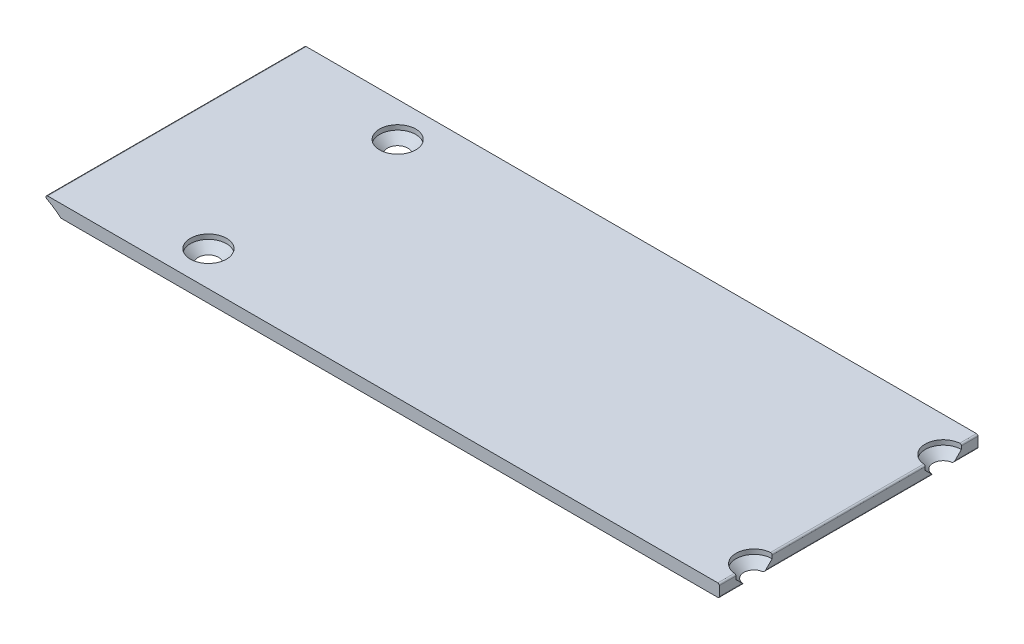
ISO-10303-21;
HEADER;
FILE_DESCRIPTION(('STEP AP214'),'2;1');
FILE_NAME('part.step','',(''),(''),'','','');
FILE_SCHEMA(('AUTOMOTIVE_DESIGN { 1 0 10303 214 1 1 1 1 }'));
ENDSEC;
DATA;
#1=APPLICATION_CONTEXT('core data for automotive mechanical design processes');
#2=APPLICATION_PROTOCOL_DEFINITION('international standard','automotive_design',2000,#1);
#3=PRODUCT_CONTEXT('',#1,'mechanical');
#4=PRODUCT('Part','Part','',(#3));
#5=PRODUCT_RELATED_PRODUCT_CATEGORY('part','',(#4));
#6=PRODUCT_DEFINITION_FORMATION('','',#4);
#7=PRODUCT_DEFINITION_CONTEXT('part definition',#1,'design');
#8=PRODUCT_DEFINITION('design','',#6,#7);
#9=PRODUCT_DEFINITION_SHAPE('','',#8);
#10=(LENGTH_UNIT() NAMED_UNIT(*) SI_UNIT(.MILLI.,.METRE.));
#11=(NAMED_UNIT(*) PLANE_ANGLE_UNIT() SI_UNIT($,.RADIAN.));
#12=(NAMED_UNIT(*) SI_UNIT($,.STERADIAN.) SOLID_ANGLE_UNIT());
#13=UNCERTAINTY_MEASURE_WITH_UNIT(LENGTH_MEASURE(1.E-05),#10,'distance_accuracy_value','');
#14=(GEOMETRIC_REPRESENTATION_CONTEXT(3) GLOBAL_UNCERTAINTY_ASSIGNED_CONTEXT((#13)) GLOBAL_UNIT_ASSIGNED_CONTEXT((#10,
#11,#12)) REPRESENTATION_CONTEXT('',''));
#15=CARTESIAN_POINT('',(0.,0.,0.));
#16=DIRECTION('',(0.,0.,1.));
#17=DIRECTION('',(1.,0.,0.));
#18=AXIS2_PLACEMENT_3D('',#15,#16,#17);
#19=CARTESIAN_POINT('',(224.5,19.5,-49.5));
#20=DIRECTION('',(0.,0.,1.));
#21=DIRECTION('',(1.,0.,0.));
#22=AXIS2_PLACEMENT_3D('',#19,#20,#21);
#23=CYLINDRICAL_SURFACE('',#22,0.5);
#24=CARTESIAN_POINT('',(224.997473577188,19.5502,-15.7148008431276));
#25=CARTESIAN_POINT('',(224.999435346923,19.5306837247014,-15.7343171943502));
#26=CARTESIAN_POINT('',(225.000256593285,19.5111223870043,-15.7538777715121));
#27=CARTESIAN_POINT('',(224.999601023149,19.4720030494915,-15.7929967929649));
#28=CARTESIAN_POINT('',(224.998122243349,19.4524450667953,-15.8125552211662));
#29=CARTESIAN_POINT('',(224.99017401051,19.3937144747557,-15.8712933209623));
#30=CARTESIAN_POINT('',(224.980166584883,19.3547410268954,-15.9102800763842));
#31=CARTESIAN_POINT('',(224.953567431979,19.2871812312321,-15.9781053720694));
#32=CARTESIAN_POINT('',(224.938891636266,19.2581856697315,-16.0073003058562));
#33=CARTESIAN_POINT('',(224.903194213026,19.2024707982459,-16.0638424882896));
#34=CARTESIAN_POINT('',(224.88219241513,19.1757447051486,-16.0911951884736));
#35=CARTESIAN_POINT('',(224.839462094014,19.1319502493728,-16.1368248142612));
#36=CARTESIAN_POINT('',(224.819151566163,19.1141135932451,-16.1556915148958));
#37=CARTESIAN_POINT('',(224.774671280116,19.0812905891297,-16.1912916478937));
#38=CARTESIAN_POINT('',(224.750504172319,19.0663022990168,-16.2080265312267));
#39=CARTESIAN_POINT('',(224.70379875283,19.0428308841408,-16.2355080086869));
#40=CARTESIAN_POINT('',(224.681925143516,19.0336448917808,-16.246780652257));
#41=CARTESIAN_POINT('',(224.636183047505,19.0183006870291,-16.2670187878611));
#42=CARTESIAN_POINT('',(224.612319992086,19.012134527886,-16.2759903053624));
#43=CARTESIAN_POINT('',(224.565616294764,19.0038197606833,-16.2903620019993));
#44=CARTESIAN_POINT('',(224.542923613795,19.0013226866013,-16.296034897223));
#45=CARTESIAN_POINT('',(224.496756074885,18.9994647849751,-16.3048342443327));
#46=CARTESIAN_POINT('',(224.47327660572,19.0001277735789,-16.3079411512267));
#47=CARTESIAN_POINT('',(224.4498,19.0025264228122,-16.3095678508379));
#48=B_SPLINE_CURVE_WITH_KNOTS('',3,(#24,#25,#26,#27,#28,#29,#30,#31,#32,#33,#34,#35,#36,#37,#38,
#39,#40,#41,#42,#43,#44,#45,#46,#47),.UNSPECIFIED.,.F.,.F.,(4,2,2,2,2,2,2,2,2,2,2,4),(0.,
0.0829495843265933,0.165970013303474,0.333085915997445,0.463694854194707,0.593898569508019,
0.692447709658672,0.790929412223871,0.869426002124152,0.947714901650063,1.01793790593091,
1.08869098652575),.UNSPECIFIED.);
#49=CARTESIAN_POINT('',(225.000000000001,19.5,-15.765));
#50=VERTEX_POINT('',#49);
#51=CARTESIAN_POINT('',(224.5,19.,-16.3038734380504));
#52=VERTEX_POINT('',#51);
#53=EDGE_CURVE('E11',#50,#52,#48,.T.);
#54=ORIENTED_EDGE('',*,*,#53,.F.);
#55=DIRECTION('',(0.,0.,1.));
#56=VECTOR('',#55,1.);
#57=CARTESIAN_POINT('',(225.,19.5,-49.5));
#58=LINE('',#57,#56);
#59=CARTESIAN_POINT('',(225.,19.5,-8.5));
#60=VERTEX_POINT('',#59);
#61=EDGE_CURVE('E322',#60,#50,#58,.F.);
#62=ORIENTED_EDGE('',*,*,#61,.F.);
#63=CARTESIAN_POINT('',(224.5,19.5,-8.5));
#64=DIRECTION('',(0.,0.,1.));
#65=DIRECTION('',(1.,0.,0.));
#66=AXIS2_PLACEMENT_3D('',#63,#64,#65);
#67=CIRCLE('',#66,0.5);
#68=CARTESIAN_POINT('',(224.5,19.,-8.5));
#69=VERTEX_POINT('',#68);
#70=EDGE_CURVE('E316',#69,#60,#67,.T.);
#71=ORIENTED_EDGE('',*,*,#70,.F.);
#72=DIRECTION('',(0.,0.,1.));
#73=VECTOR('',#72,1.);
#74=CARTESIAN_POINT('',(224.5,19.,-49.5));
#75=LINE('',#74,#73);
#76=EDGE_CURVE('E305',#52,#69,#75,.T.);
#77=ORIENTED_EDGE('',*,*,#76,.F.);
#78=EDGE_LOOP('',(#54,#62,#71,#77));
#79=FACE_BOUND('',#78,.T.);
#80=ADVANCED_FACE('F39',(#79),#23,.T.);
#81=CARTESIAN_POINT('',(225.,23.,-49.5));
#82=DIRECTION('',(1.,0.,0.));
#83=DIRECTION('',(0.,0.,-1.));
#84=AXIS2_PLACEMENT_3D('',#81,#82,#83);
#85=PLANE('',#84);
#86=DIRECTION('',(0.,0.707106781186549,-0.707106781186546));
#87=VECTOR('',#86,1.);
#88=CARTESIAN_POINT('',(225.,15.765,-19.5));
#89=LINE('',#88,#87);
#90=CARTESIAN_POINT('',(225.,19.4999999999997,-23.2350000000003));
#91=VERTEX_POINT('',#90);
#92=CARTESIAN_POINT('',(225.,21.5,-25.235));
#93=VERTEX_POINT('',#92);
#94=EDGE_CURVE('E298',#91,#93,#89,.T.);
#95=ORIENTED_EDGE('',*,*,#94,.F.);
#96=CARTESIAN_POINT('',(225.,19.4999999999997,-75.7649999999997));
#97=VERTEX_POINT('',#96);
#98=EDGE_CURVE('E295',#91,#97,#58,.F.);
#99=ORIENTED_EDGE('',*,*,#98,.T.);
#100=DIRECTION('',(0.,0.707106781186549,0.707106781186546));
#101=VECTOR('',#100,1.);
#102=CARTESIAN_POINT('',(225.,15.765,-79.5));
#103=LINE('',#102,#101);
#104=CARTESIAN_POINT('',(225.,21.5,-73.765));
#105=VERTEX_POINT('',#104);
#106=EDGE_CURVE('E198',#97,#105,#103,.T.);
#107=ORIENTED_EDGE('',*,*,#106,.T.);
#108=DIRECTION('',(0.,1.,0.));
#109=VECTOR('',#108,1.);
#110=CARTESIAN_POINT('',(225.,23.,-73.765));
#111=LINE('',#110,#109);
#112=CARTESIAN_POINT('',(225.,22.5,-73.765));
#113=VERTEX_POINT('',#112);
#114=EDGE_CURVE('E177',#105,#113,#111,.T.);
#115=ORIENTED_EDGE('',*,*,#114,.T.);
#116=DIRECTION('',(0.,0.,1.));
#117=VECTOR('',#116,1.);
#118=CARTESIAN_POINT('',(225.,22.5,-49.5));
#119=LINE('',#118,#117);
#120=CARTESIAN_POINT('',(225.,22.5,-25.235));
#121=VERTEX_POINT('',#120);
#122=EDGE_CURVE('E319',#113,#121,#119,.T.);
#123=ORIENTED_EDGE('',*,*,#122,.T.);
#124=DIRECTION('',(0.,1.,0.));
#125=VECTOR('',#124,1.);
#126=CARTESIAN_POINT('',(225.,23.,-25.235));
#127=LINE('',#126,#125);
#128=EDGE_CURVE('E60',#93,#121,#127,.T.);
#129=ORIENTED_EDGE('',*,*,#128,.F.);
#130=EDGE_LOOP('',(#95,#99,#107,#115,#123,#129));
#131=FACE_BOUND('',#130,.T.);
#132=ADVANCED_FACE('F259',(#131),#85,.T.);
#133=CARTESIAN_POINT('',(225.,19.,-49.5));
#134=DIRECTION('',(0.,-1.,0.));
#135=DIRECTION('',(1.,0.,0.));
#136=AXIS2_PLACEMENT_3D('',#133,#134,#135);
#137=PLANE('',#136);
#138=CARTESIAN_POINT('',(225.,19.,-19.5));
#139=DIRECTION('',(0.,-1.,0.));
#140=DIRECTION('',(1.,0.,0.));
#141=AXIS2_PLACEMENT_3D('',#138,#139,#140);
#142=CIRCLE('',#141,3.235);
#143=CARTESIAN_POINT('',(224.5,18.9999999999996,-22.6961265619493));
#144=VERTEX_POINT('',#143);
#145=EDGE_CURVE('E302',#52,#144,#142,.T.);
#146=ORIENTED_EDGE('',*,*,#145,.F.);
#147=ORIENTED_EDGE('',*,*,#76,.T.);
#148=DIRECTION('',(1.,0.,0.));
#149=VECTOR('',#148,1.);
#150=CARTESIAN_POINT('',(225.,19.,-8.5));
#151=LINE('',#150,#149);
#152=CARTESIAN_POINT('',(16.431676725155,19.,-8.5));
#153=VERTEX_POINT('',#152);
#154=EDGE_CURVE('E340',#153,#69,#151,.T.);
#155=ORIENTED_EDGE('',*,*,#154,.F.);
#156=DIRECTION('',(0.,0.,1.));
#157=VECTOR('',#156,1.);
#158=CARTESIAN_POINT('',(16.431676725155,19.,-49.5));
#159=LINE('',#158,#157);
#160=CARTESIAN_POINT('',(16.431676725155,19.,-90.5));
#161=VERTEX_POINT('',#160);
#162=EDGE_CURVE('E309',#153,#161,#159,.F.);
#163=ORIENTED_EDGE('',*,*,#162,.T.);
#164=DIRECTION('',(1.,0.,0.));
#165=VECTOR('',#164,1.);
#166=CARTESIAN_POINT('',(225.,19.,-90.5));
#167=LINE('',#166,#165);
#168=CARTESIAN_POINT('',(224.5,19.,-90.5));
#169=VERTEX_POINT('',#168);
#170=EDGE_CURVE('E376',#161,#169,#167,.T.);
#171=ORIENTED_EDGE('',*,*,#170,.T.);
#172=DIRECTION('',(0.,0.,-1.));
#173=VECTOR('',#172,1.);
#174=CARTESIAN_POINT('',(224.5,19.,-49.5));
#175=LINE('',#174,#173);
#176=CARTESIAN_POINT('',(224.5,19.,-82.6961265619497));
#177=VERTEX_POINT('',#176);
#178=EDGE_CURVE('E382',#177,#169,#175,.T.);
#179=ORIENTED_EDGE('',*,*,#178,.F.);
#180=CARTESIAN_POINT('',(225.,19.,-79.5));
#181=DIRECTION('',(0.,1.,0.));
#182=DIRECTION('',(1.,0.,0.));
#183=AXIS2_PLACEMENT_3D('',#180,#181,#182);
#184=CIRCLE('',#183,3.235);
#185=CARTESIAN_POINT('',(224.5,18.9999999999996,-76.3038734380507));
#186=VERTEX_POINT('',#185);
#187=EDGE_CURVE('E199',#177,#186,#184,.T.);
#188=ORIENTED_EDGE('',*,*,#187,.T.);
#189=EDGE_CURVE('E293',#186,#144,#75,.T.);
#190=ORIENTED_EDGE('',*,*,#189,.T.);
#191=EDGE_LOOP('',(#146,#147,#155,#163,#171,#179,#188,#190));
#192=FACE_BOUND('',#191,.T.);
#193=CARTESIAN_POINT('',(52.,19.,-19.5));
#194=DIRECTION('',(0.,-1.,0.));
#195=DIRECTION('',(1.,0.,0.));
#196=AXIS2_PLACEMENT_3D('',#193,#194,#195);
#197=CIRCLE('',#196,3.23499999999998);
#198=CARTESIAN_POINT('',(55.235,19.,-19.5));
#199=VERTEX_POINT('',#198);
#200=EDGE_CURVE('E337',#199,#199,#197,.T.);
#201=ORIENTED_EDGE('',*,*,#200,.F.);
#202=EDGE_LOOP('',(#201));
#203=FACE_BOUND('',#202,.T.);
#204=CARTESIAN_POINT('',(52.,19.,-79.5));
#205=DIRECTION('',(0.,1.,0.));
#206=DIRECTION('',(1.,0.,0.));
#207=AXIS2_PLACEMENT_3D('',#204,#205,#206);
#208=CIRCLE('',#207,3.23499999999998);
#209=CARTESIAN_POINT('',(55.235,19.,-79.5));
#210=VERTEX_POINT('',#209);
#211=EDGE_CURVE('E403',#210,#210,#208,.T.);
#212=ORIENTED_EDGE('',*,*,#211,.T.);
#213=EDGE_LOOP('',(#212));
#214=FACE_BOUND('',#213,.T.);
#215=ADVANCED_FACE('F268',(#192,#203,#214),#137,.T.);
#216=CARTESIAN_POINT('',(224.5,22.5,-49.5));
#217=DIRECTION('',(0.,0.,1.));
#218=DIRECTION('',(1.,0.,0.));
#219=AXIS2_PLACEMENT_3D('',#216,#217,#218);
#220=CYLINDRICAL_SURFACE('',#219,0.5);
#221=CARTESIAN_POINT('',(224.5,23.,-13.786837565761));
#222=CARTESIAN_POINT('',(224.52801051019,23.0000245800375,-13.7843781717152));
#223=CARTESIAN_POINT('',(224.556035573133,22.9976475663107,-13.7821408458492));
#224=CARTESIAN_POINT('',(224.611309544637,22.9882508167163,-13.7781220117914));
#225=CARTESIAN_POINT('',(224.63855900199,22.9812344531948,-13.7763401738088));
#226=CARTESIAN_POINT('',(224.691535372127,22.9627134831437,-13.7732394644175));
#227=CARTESIAN_POINT('',(224.717261360065,22.9512061818478,-13.7719208718816));
#228=CARTESIAN_POINT('',(224.766427151289,22.9240340275891,-13.7697056636091));
#229=CARTESIAN_POINT('',(224.789867444531,22.9083700683287,-13.7688089572797));
#230=CARTESIAN_POINT('',(224.833749605433,22.8733599218072,-13.7673681257734));
#231=CARTESIAN_POINT('',(224.854197367657,22.854021150665,-13.7668233000454));
#232=CARTESIAN_POINT('',(224.891571141453,22.8121840210353,-13.7659945548275));
#233=CARTESIAN_POINT('',(224.908496410798,22.7896849983171,-13.765710690282));
#234=CARTESIAN_POINT('',(224.938354232142,22.7421457925394,-13.7653117931064));
#235=CARTESIAN_POINT('',(224.951282554526,22.7171029545515,-13.7651969388452));
#236=CARTESIAN_POINT('',(224.972750878551,22.6652087188528,-13.7650546291667));
#237=CARTESIAN_POINT('',(224.981293368484,22.6383583564402,-13.765027124146));
#238=CARTESIAN_POINT('',(224.991669492663,22.5927924927522,-13.7650045522906));
#239=CARTESIAN_POINT('',(224.994791395496,22.5743599536835,-13.7650017127413));
#240=CARTESIAN_POINT('',(224.998956483521,22.5372874926583,-13.764999990024));
#241=CARTESIAN_POINT('',(225.000002549685,22.5186478942758,-13.7650011013666));
#242=CARTESIAN_POINT('',(225.,22.5,-13.765));
#243=B_SPLINE_CURVE_WITH_KNOTS('',3,(#221,#222,#223,#224,#225,#226,#227,#228,#229,#230,#231,
#232,#233,#234,#235,#236,#237,#238,#239,#240,#241,#242),.UNSPECIFIED.,.F.,.F.,(4,2,2,2,2,2,2,2,
2,2,4),(0.,0.0842466434316218,0.168432115150683,0.252668179828543,0.336886147979862,
0.420935927415869,0.505003399183274,0.589159529979408,0.673267862067995,0.729243844277357,
0.785142085159218),.UNSPECIFIED.);
#244=CARTESIAN_POINT('',(224.5,23.,-13.786837565761));
#245=VERTEX_POINT('',#244);
#246=CARTESIAN_POINT('',(225.,22.5,-13.765));
#247=VERTEX_POINT('',#246);
#248=EDGE_CURVE('E347',#245,#247,#243,.T.);
#249=ORIENTED_EDGE('',*,*,#248,.F.);
#250=DIRECTION('',(0.,0.,1.));
#251=VECTOR('',#250,1.);
#252=CARTESIAN_POINT('',(224.5,23.,-49.5));
#253=LINE('',#252,#251);
#254=CARTESIAN_POINT('',(224.5,23.,-8.5));
#255=VERTEX_POINT('',#254);
#256=EDGE_CURVE('E328',#255,#245,#253,.F.);
#257=ORIENTED_EDGE('',*,*,#256,.F.);
#258=CARTESIAN_POINT('',(224.5,22.5,-8.5));
#259=DIRECTION('',(0.,0.,1.));
#260=DIRECTION('',(1.,0.,0.));
#261=AXIS2_PLACEMENT_3D('',#258,#259,#260);
#262=CIRCLE('',#261,0.5);
#263=CARTESIAN_POINT('',(225.,22.5,-8.5));
#264=VERTEX_POINT('',#263);
#265=EDGE_CURVE('E314',#264,#255,#262,.T.);
#266=ORIENTED_EDGE('',*,*,#265,.F.);
#267=EDGE_CURVE('E318',#247,#264,#119,.T.);
#268=ORIENTED_EDGE('',*,*,#267,.F.);
#269=EDGE_LOOP('',(#249,#257,#266,#268));
#270=FACE_BOUND('',#269,.T.);
#271=ADVANCED_FACE('F286',(#270),#220,.T.);
#272=CARTESIAN_POINT('',(0.,0.,-49.5));
#273=DIRECTION('',(0.,0.,1.));
#274=DIRECTION('',(1.,0.,0.));
#275=AXIS2_PLACEMENT_3D('',#272,#273,#274);
#276=CYLINDRICAL_SURFACE('',#275,25.);
#277=DIRECTION('',(0.,0.,1.));
#278=VECTOR('',#277,1.);
#279=CARTESIAN_POINT('',(11.7647058823529,22.0588235294118,-49.5));
#280=LINE('',#279,#278);
#281=CARTESIAN_POINT('',(11.7647058823529,22.0588235294118,-8.5));
#282=VERTEX_POINT('',#281);
#283=CARTESIAN_POINT('',(11.7647058823529,22.0588235294118,-90.5));
#284=VERTEX_POINT('',#283);
#285=EDGE_CURVE('E331',#282,#284,#280,.F.);
#286=ORIENTED_EDGE('',*,*,#285,.T.);
#287=CARTESIAN_POINT('',(0.,0.,-90.5));
#288=DIRECTION('',(0.,0.,-1.));
#289=DIRECTION('',(1.,0.,0.));
#290=AXIS2_PLACEMENT_3D('',#287,#288,#289);
#291=CIRCLE('',#290,25.);
#292=CARTESIAN_POINT('',(16.1094869854461,19.1176470588235,-90.5));
#293=VERTEX_POINT('',#292);
#294=EDGE_CURVE('E374',#284,#293,#291,.T.);
#295=ORIENTED_EDGE('',*,*,#294,.T.);
#296=DIRECTION('',(0.,0.,1.));
#297=VECTOR('',#296,1.);
#298=CARTESIAN_POINT('',(16.1094869854461,19.1176470588235,-49.5));
#299=LINE('',#298,#297);
#300=CARTESIAN_POINT('',(16.1094869854461,19.1176470588235,-8.5));
#301=VERTEX_POINT('',#300);
#302=EDGE_CURVE('E333',#293,#301,#299,.T.);
#303=ORIENTED_EDGE('',*,*,#302,.T.);
#304=CARTESIAN_POINT('',(0.,0.,-8.5));
#305=DIRECTION('',(0.,0.,-1.));
#306=DIRECTION('',(1.,0.,0.));
#307=AXIS2_PLACEMENT_3D('',#304,#305,#306);
#308=CIRCLE('',#307,25.);
#309=EDGE_CURVE('E444',#282,#301,#308,.T.);
#310=ORIENTED_EDGE('',*,*,#309,.F.);
#311=EDGE_LOOP('',(#286,#295,#303,#310));
#312=FACE_BOUND('',#311,.T.);
#313=ADVANCED_FACE('F380',(#312),#276,.F.);
#314=CARTESIAN_POINT('',(9.79795897113272,23.,-49.5));
#315=DIRECTION('',(0.,1.,0.));
#316=DIRECTION('',(0.,0.,1.));
#317=AXIS2_PLACEMENT_3D('',#314,#315,#316);
#318=PLANE('',#317);
#319=CARTESIAN_POINT('',(225.,23.,-19.5));
#320=DIRECTION('',(0.,1.,0.));
#321=DIRECTION('',(0.,0.,1.));
#322=AXIS2_PLACEMENT_3D('',#319,#320,#321);
#323=CIRCLE('',#322,5.73499999999999);
#324=CARTESIAN_POINT('',(224.5,23.,-25.213162434239));
#325=VERTEX_POINT('',#324);
#326=EDGE_CURVE('E422',#325,#245,#323,.T.);
#327=ORIENTED_EDGE('',*,*,#326,.F.);
#328=CARTESIAN_POINT('',(224.5,23.,-73.786837565761));
#329=VERTEX_POINT('',#328);
#330=EDGE_CURVE('E327',#325,#329,#253,.F.);
#331=ORIENTED_EDGE('',*,*,#330,.T.);
#332=CARTESIAN_POINT('',(225.,23.,-79.5));
#333=DIRECTION('',(0.,-1.,0.));
#334=DIRECTION('',(0.,0.,-1.));
#335=AXIS2_PLACEMENT_3D('',#332,#333,#334);
#336=CIRCLE('',#335,5.73499999999999);
#337=CARTESIAN_POINT('',(224.5,23.,-85.213162434239));
#338=VERTEX_POINT('',#337);
#339=EDGE_CURVE('E182',#329,#338,#336,.T.);
#340=ORIENTED_EDGE('',*,*,#339,.T.);
#341=DIRECTION('',(0.,0.,-1.));
#342=VECTOR('',#341,1.);
#343=CARTESIAN_POINT('',(224.5,23.,-49.5));
#344=LINE('',#343,#342);
#345=CARTESIAN_POINT('',(224.5,23.,-90.5));
#346=VERTEX_POINT('',#345);
#347=EDGE_CURVE('E401',#346,#338,#344,.F.);
#348=ORIENTED_EDGE('',*,*,#347,.F.);
#349=DIRECTION('',(-1.,0.,0.));
#350=VECTOR('',#349,1.);
#351=CARTESIAN_POINT('',(9.79795897113272,23.,-90.5));
#352=LINE('',#351,#350);
#353=CARTESIAN_POINT('',(12.,23.,-90.5));
#354=VERTEX_POINT('',#353);
#355=EDGE_CURVE('E383',#346,#354,#352,.T.);
#356=ORIENTED_EDGE('',*,*,#355,.T.);
#357=DIRECTION('',(0.,0.,1.));
#358=VECTOR('',#357,1.);
#359=CARTESIAN_POINT('',(12.,23.,-49.5));
#360=LINE('',#359,#358);
#361=CARTESIAN_POINT('',(12.,23.,-8.5));
#362=VERTEX_POINT('',#361);
#363=EDGE_CURVE('E325',#354,#362,#360,.T.);
#364=ORIENTED_EDGE('',*,*,#363,.T.);
#365=DIRECTION('',(-1.,0.,0.));
#366=VECTOR('',#365,1.);
#367=CARTESIAN_POINT('',(9.79795897113272,23.,-8.5));
#368=LINE('',#367,#366);
#369=EDGE_CURVE('E442',#255,#362,#368,.T.);
#370=ORIENTED_EDGE('',*,*,#369,.F.);
#371=ORIENTED_EDGE('',*,*,#256,.T.);
#372=EDGE_LOOP('',(#327,#331,#340,#348,#356,#364,#370,#371));
#373=FACE_BOUND('',#372,.T.);
#374=CARTESIAN_POINT('',(52.,23.,-19.5));
#375=DIRECTION('',(0.,1.,0.));
#376=DIRECTION('',(0.,0.,1.));
#377=AXIS2_PLACEMENT_3D('',#374,#375,#376);
#378=CIRCLE('',#377,5.735);
#379=CARTESIAN_POINT('',(52.,23.,-13.765));
#380=VERTEX_POINT('',#379);
#381=EDGE_CURVE('E432',#380,#380,#378,.T.);
#382=ORIENTED_EDGE('',*,*,#381,.F.);
#383=EDGE_LOOP('',(#382));
#384=FACE_BOUND('',#383,.T.);
#385=CARTESIAN_POINT('',(52.,23.,-79.5));
#386=DIRECTION('',(0.,-1.,0.));
#387=DIRECTION('',(0.,0.,-1.));
#388=AXIS2_PLACEMENT_3D('',#385,#386,#387);
#389=CIRCLE('',#388,5.735);
#390=CARTESIAN_POINT('',(52.,23.,-85.235));
#391=VERTEX_POINT('',#390);
#392=EDGE_CURVE('E192',#391,#391,#389,.T.);
#393=ORIENTED_EDGE('',*,*,#392,.T.);
#394=EDGE_LOOP('',(#393));
#395=FACE_BOUND('',#394,.T.);
#396=ADVANCED_FACE('F475',(#373,#384,#395),#318,.T.);
#397=DIRECTION('',(0.,-0.707106781186549,-0.707106781186546));
#398=VECTOR('',#397,1.);
#399=CARTESIAN_POINT('',(225.,15.765,-19.5));
#400=LINE('',#399,#398);
#401=CARTESIAN_POINT('',(225.,21.5,-13.765));
#402=VERTEX_POINT('',#401);
#403=EDGE_CURVE('E455',#402,#50,#400,.T.);
#404=ORIENTED_EDGE('',*,*,#403,.F.);
#405=DIRECTION('',(0.,1.,0.));
#406=VECTOR('',#405,1.);
#407=CARTESIAN_POINT('',(225.,23.,-13.765));
#408=LINE('',#407,#406);
#409=EDGE_CURVE('E430',#247,#402,#408,.F.);
#410=ORIENTED_EDGE('',*,*,#409,.F.);
#411=ORIENTED_EDGE('',*,*,#267,.T.);
#412=DIRECTION('',(0.,1.,0.));
#413=VECTOR('',#412,1.);
#414=CARTESIAN_POINT('',(225.,23.,-8.5));
#415=LINE('',#414,#413);
#416=EDGE_CURVE('E439',#60,#264,#415,.T.);
#417=ORIENTED_EDGE('',*,*,#416,.F.);
#418=ORIENTED_EDGE('',*,*,#61,.T.);
#419=EDGE_LOOP('',(#404,#410,#411,#417,#418));
#420=FACE_BOUND('',#419,.T.);
#421=ADVANCED_FACE('F271',(#420),#85,.T.);
#422=CARTESIAN_POINT('',(0.,0.,-8.5));
#423=DIRECTION('',(0.,0.,1.));
#424=DIRECTION('',(1.,0.,0.));
#425=AXIS2_PLACEMENT_3D('',#422,#423,#424);
#426=PLANE('',#425);
#427=ORIENTED_EDGE('',*,*,#154,.T.);
#428=ORIENTED_EDGE('',*,*,#70,.T.);
#429=ORIENTED_EDGE('',*,*,#416,.T.);
#430=ORIENTED_EDGE('',*,*,#265,.T.);
#431=ORIENTED_EDGE('',*,*,#369,.T.);
#432=CARTESIAN_POINT('',(12.,22.5,-8.5));
#433=DIRECTION('',(0.,0.,1.));
#434=DIRECTION('',(1.,0.,0.));
#435=AXIS2_PLACEMENT_3D('',#432,#433,#434);
#436=CIRCLE('',#435,0.5);
#437=EDGE_CURVE('E68',#362,#282,#436,.T.);
#438=ORIENTED_EDGE('',*,*,#437,.T.);
#439=ORIENTED_EDGE('',*,*,#309,.T.);
#440=CARTESIAN_POINT('',(16.431676725155,19.5,-8.5));
#441=DIRECTION('',(0.,0.,1.));
#442=DIRECTION('',(1.,0.,0.));
#443=AXIS2_PLACEMENT_3D('',#440,#441,#442);
#444=CIRCLE('',#443,0.5);
#445=EDGE_CURVE('E307',#301,#153,#444,.T.);
#446=ORIENTED_EDGE('',*,*,#445,.T.);
#447=EDGE_LOOP('',(#427,#428,#429,#430,#431,#438,#439,#446));
#448=FACE_BOUND('',#447,.T.);
#449=ADVANCED_FACE('F278',(#448),#426,.T.);
#450=CARTESIAN_POINT('',(224.4498,19.0025264228122,-22.6904321491621));
#451=CARTESIAN_POINT('',(224.473912783948,19.0000597275341,-22.6921009754628));
#452=CARTESIAN_POINT('',(224.498028111811,18.9994281876427,-22.6953339264481));
#453=CARTESIAN_POINT('',(224.545399699969,19.001515151919,-22.704515896754));
#454=CARTESIAN_POINT('',(224.56866125492,19.0042071387781,-22.7104431816618));
#455=CARTESIAN_POINT('',(224.613789728163,19.0125779195787,-22.7246165656252));
#456=CARTESIAN_POINT('',(224.635661016538,19.0182467766423,-22.7328549079435));
#457=CARTESIAN_POINT('',(224.677745569222,19.0321341870717,-22.751276290354));
#458=CARTESIAN_POINT('',(224.697955107078,19.0403582833826,-22.7614635394649));
#459=CARTESIAN_POINT('',(224.743859210275,19.0624975246201,-22.7876526721374));
#460=CARTESIAN_POINT('',(224.768670398217,19.0773847349544,-22.8043832747364));
#461=CARTESIAN_POINT('',(224.814359443548,19.1101645212765,-22.8400954853529));
#462=CARTESIAN_POINT('',(224.835231305483,19.1280616010911,-22.859080453995));
#463=CARTESIAN_POINT('',(224.879027981971,19.1720062790984,-22.904957706222));
#464=CARTESIAN_POINT('',(224.900523489962,19.1988440491792,-22.9324551905583));
#465=CARTESIAN_POINT('',(224.937047680638,19.2548277158215,-22.9893110279637));
#466=CARTESIAN_POINT('',(224.95206786882,19.2839765851948,-23.0186717677633));
#467=CARTESIAN_POINT('',(224.976240959489,19.3442127490654,-23.0791555184662));
#468=CARTESIAN_POINT('',(224.985260856565,19.3753282367652,-23.1103028397217));
#469=CARTESIAN_POINT('',(224.997181351564,19.4381045993369,-23.1731088333715));
#470=CARTESIAN_POINT('',(225.000091272537,19.4697645688589,-23.2047666523142));
#471=CARTESIAN_POINT('',(224.999950033814,19.5176897510578,-23.2526886788105));
#472=CARTESIAN_POINT('',(224.99910661579,19.5339688127914,-23.2689666860757));
#473=CARTESIAN_POINT('',(224.997473577188,19.5502,-23.2851991568724));
#474=B_SPLINE_CURVE_WITH_KNOTS('',3,(#450,#451,#452,#453,#454,#455,#456,#457,#458,#459,#460,
#461,#462,#463,#464,#465,#466,#467,#468,#469,#470,#471,#472,#473),.UNSPECIFIED.,.F.,.F.,(4,2,2,
2,2,2,2,2,2,2,2,4),(0.,0.0726625084962656,0.144748995318825,0.216596370776983,0.288600702101629,
0.388323515290763,0.48819689877555,0.61957514848267,0.751125223214306,0.885501921552288,
1.01967342859982,1.08872455492892),.UNSPECIFIED.);
#475=EDGE_CURVE('E53',#144,#91,#474,.T.);
#476=ORIENTED_EDGE('',*,*,#475,.F.);
#477=ORIENTED_EDGE('',*,*,#189,.F.);
#478=CARTESIAN_POINT('',(224.4498,19.0025264228122,-76.3095678508379));
#479=CARTESIAN_POINT('',(224.473912783948,19.0000597275341,-76.3078990245372));
#480=CARTESIAN_POINT('',(224.498028111811,18.9994281876427,-76.3046660735519));
#481=CARTESIAN_POINT('',(224.545399699969,19.001515151919,-76.295484103246));
#482=CARTESIAN_POINT('',(224.56866125492,19.0042071387781,-76.2895568183382));
#483=CARTESIAN_POINT('',(224.613789728163,19.0125779195787,-76.2753834343748));
#484=CARTESIAN_POINT('',(224.635661016538,19.0182467766423,-76.2671450920566));
#485=CARTESIAN_POINT('',(224.677745569222,19.0321341870717,-76.248723709646));
#486=CARTESIAN_POINT('',(224.697955107078,19.0403582833826,-76.2385364605351));
#487=CARTESIAN_POINT('',(224.743859210275,19.0624975246201,-76.2123473278626));
#488=CARTESIAN_POINT('',(224.768670398217,19.0773847349544,-76.1956167252636));
#489=CARTESIAN_POINT('',(224.814359443548,19.1101645212765,-76.1599045146471));
#490=CARTESIAN_POINT('',(224.835231305483,19.1280616010911,-76.140919546005));
#491=CARTESIAN_POINT('',(224.879027981971,19.1720062790984,-76.095042293778));
#492=CARTESIAN_POINT('',(224.900523489962,19.1988440491792,-76.0675448094417));
#493=CARTESIAN_POINT('',(224.937047680638,19.2548277158215,-76.0106889720363));
#494=CARTESIAN_POINT('',(224.95206786882,19.2839765851948,-75.9813282322367));
#495=CARTESIAN_POINT('',(224.976240959489,19.3442127490654,-75.9208444815338));
#496=CARTESIAN_POINT('',(224.985260856565,19.3753282367652,-75.8896971602783));
#497=CARTESIAN_POINT('',(224.997181351564,19.4381045993369,-75.8268911666286));
#498=CARTESIAN_POINT('',(225.000091272537,19.4697645688589,-75.7952333476858));
#499=CARTESIAN_POINT('',(224.999950033814,19.5176897510578,-75.7473113211895));
#500=CARTESIAN_POINT('',(224.99910661579,19.5339688127914,-75.7310333139243));
#501=CARTESIAN_POINT('',(224.997473577188,19.5502,-75.7148008431276));
#502=B_SPLINE_CURVE_WITH_KNOTS('',3,(#478,#479,#480,#481,#482,#483,#484,#485,#486,#487,#488,
#489,#490,#491,#492,#493,#494,#495,#496,#497,#498,#499,#500,#501),.UNSPECIFIED.,.F.,.F.,(4,2,2,
2,2,2,2,2,2,2,2,4),(0.,0.0726625084962642,0.144748995318826,0.216596370776979,0.288600702101632,
0.388323515290762,0.488196898775548,0.619575148482667,0.751125223214309,0.885501921552292,
1.01967342859982,1.08872455492892),.UNSPECIFIED.);
#503=EDGE_CURVE('E201',#186,#97,#502,.T.);
#504=ORIENTED_EDGE('',*,*,#503,.T.);
#505=ORIENTED_EDGE('',*,*,#98,.F.);
#506=EDGE_LOOP('',(#476,#477,#504,#505));
#507=FACE_BOUND('',#506,.T.);
#508=ADVANCED_FACE('F261',(#507),#23,.T.);
#509=CARTESIAN_POINT('',(225.,22.5,-25.235));
#510=CARTESIAN_POINT('',(225.000023888111,22.5281270241259,-25.2349941066282));
#511=CARTESIAN_POINT('',(224.997628039554,22.556246933712,-25.2349999014649));
#512=CARTESIAN_POINT('',(224.988173067001,22.6116702744218,-25.2349913088145));
#513=CARTESIAN_POINT('',(224.981117539265,22.6389743182435,-25.2349769368822));
#514=CARTESIAN_POINT('',(224.96251440232,22.6920222990551,-25.2348845547247));
#515=CARTESIAN_POINT('',(224.950964618012,22.7177654736426,-25.2348065136652));
#516=CARTESIAN_POINT('',(224.923711170573,22.7669429593841,-25.2345088040353));
#517=CARTESIAN_POINT('',(224.908008234195,22.7903776735078,-25.2342891602342));
#518=CARTESIAN_POINT('',(224.872898824657,22.8342695592799,-25.2336181590638));
#519=CARTESIAN_POINT('',(224.853493566749,22.8547277040867,-25.2331668776456));
#520=CARTESIAN_POINT('',(224.811527066783,22.8920972800601,-25.2319405716461));
#521=CARTESIAN_POINT('',(224.788965308908,22.9090081304163,-25.2311654941107));
#522=CARTESIAN_POINT('',(224.741367025908,22.9387817108491,-25.2292146167893));
#523=CARTESIAN_POINT('',(224.716333369465,22.9516490625717,-25.2280392777218));
#524=CARTESIAN_POINT('',(224.664490735982,22.9729984387523,-25.2252362893703));
#525=CARTESIAN_POINT('',(224.637682713693,22.9814828003144,-25.2236088818524));
#526=CARTESIAN_POINT('',(224.592262266938,22.9917659002081,-25.220516207053));
#527=CARTESIAN_POINT('',(224.573922086398,22.994853101934,-25.2191801359247));
#528=CARTESIAN_POINT('',(224.537054274022,22.9989699440721,-25.2163144733588));
#529=CARTESIAN_POINT('',(224.518526952875,23.000002564215,-25.2147851656005));
#530=CARTESIAN_POINT('',(224.5,23.,-25.213162434239));
#531=B_SPLINE_CURVE_WITH_KNOTS('',3,(#509,#510,#511,#512,#513,#514,#515,#516,#517,#518,#519,
#520,#521,#522,#523,#524,#525,#526,#527,#528,#529,#530),.UNSPECIFIED.,.F.,.F.,(4,2,2,2,2,2,2,2,
2,2,4),(0.,0.0842690311517414,0.168473100829007,0.252717973810019,0.336948114676779,
0.42115065519631,0.505366971738403,0.589486677461797,0.673561482340996,0.729391894278507,
0.785141276964555),.UNSPECIFIED.);
#532=EDGE_CURVE('E336',#121,#325,#531,.T.);
#533=ORIENTED_EDGE('',*,*,#532,.F.);
#534=ORIENTED_EDGE('',*,*,#122,.F.);
#535=CARTESIAN_POINT('',(225.,22.5,-73.765));
#536=CARTESIAN_POINT('',(225.000023888111,22.5281270241259,-73.7650058933718));
#537=CARTESIAN_POINT('',(224.997628039554,22.556246933712,-73.7650000985352));
#538=CARTESIAN_POINT('',(224.988173067001,22.6116702744218,-73.7650086911855));
#539=CARTESIAN_POINT('',(224.981117539265,22.6389743182435,-73.7650230631178));
#540=CARTESIAN_POINT('',(224.96251440232,22.6920222990551,-73.7651154452753));
#541=CARTESIAN_POINT('',(224.950964618012,22.7177654736426,-73.7651934863349));
#542=CARTESIAN_POINT('',(224.923711170573,22.7669429593841,-73.7654911959647));
#543=CARTESIAN_POINT('',(224.908008234195,22.7903776735078,-73.7657108397658));
#544=CARTESIAN_POINT('',(224.872898824657,22.8342695592799,-73.7663818409362));
#545=CARTESIAN_POINT('',(224.853493566749,22.8547277040867,-73.7668331223544));
#546=CARTESIAN_POINT('',(224.811527066783,22.8920972800601,-73.7680594283539));
#547=CARTESIAN_POINT('',(224.788965308908,22.9090081304163,-73.7688345058893));
#548=CARTESIAN_POINT('',(224.741367025908,22.9387817108491,-73.7707853832107));
#549=CARTESIAN_POINT('',(224.716333369465,22.9516490625717,-73.7719607222782));
#550=CARTESIAN_POINT('',(224.664490735982,22.9729984387523,-73.7747637106297));
#551=CARTESIAN_POINT('',(224.637682713693,22.9814828003144,-73.7763911181476));
#552=CARTESIAN_POINT('',(224.592262266938,22.9917659002081,-73.779483792947));
#553=CARTESIAN_POINT('',(224.573922086398,22.994853101934,-73.7808198640754));
#554=CARTESIAN_POINT('',(224.537054274022,22.9989699440721,-73.7836855266412));
#555=CARTESIAN_POINT('',(224.518526952875,23.000002564215,-73.7852148343995));
#556=CARTESIAN_POINT('',(224.5,23.,-73.786837565761));
#557=B_SPLINE_CURVE_WITH_KNOTS('',3,(#535,#536,#537,#538,#539,#540,#541,#542,#543,#544,#545,
#546,#547,#548,#549,#550,#551,#552,#553,#554,#555,#556),.UNSPECIFIED.,.F.,.F.,(4,2,2,2,2,2,2,2,
2,2,4),(0.,0.0842690311517414,0.168473100829007,0.25271797381001,0.336948114676778,
0.421150655196346,0.505366971738402,0.589486677461796,0.673561482340995,0.729391894278506,
0.785141276964554),.UNSPECIFIED.);
#558=EDGE_CURVE('E241',#113,#329,#557,.T.);
#559=ORIENTED_EDGE('',*,*,#558,.T.);
#560=ORIENTED_EDGE('',*,*,#330,.F.);
#561=EDGE_LOOP('',(#533,#534,#559,#560));
#562=FACE_BOUND('',#561,.T.);
#563=ADVANCED_FACE('F277',(#562),#220,.T.);
#564=CARTESIAN_POINT('',(16.431676725155,19.5,-49.5));
#565=DIRECTION('',(0.,0.,1.));
#566=DIRECTION('',(1.,0.,0.));
#567=AXIS2_PLACEMENT_3D('',#564,#565,#566);
#568=CYLINDRICAL_SURFACE('',#567,0.5);
#569=ORIENTED_EDGE('',*,*,#302,.F.);
#570=CARTESIAN_POINT('',(16.431676725155,19.5,-90.5));
#571=DIRECTION('',(0.,0.,1.));
#572=DIRECTION('',(1.,0.,0.));
#573=AXIS2_PLACEMENT_3D('',#570,#571,#572);
#574=CIRCLE('',#573,0.5);
#575=EDGE_CURVE('E364',#293,#161,#574,.T.);
#576=ORIENTED_EDGE('',*,*,#575,.T.);
#577=ORIENTED_EDGE('',*,*,#162,.F.);
#578=ORIENTED_EDGE('',*,*,#445,.F.);
#579=EDGE_LOOP('',(#569,#576,#577,#578));
#580=FACE_BOUND('',#579,.T.);
#581=ADVANCED_FACE('F284',(#580),#568,.T.);
#582=CARTESIAN_POINT('',(12.,22.5,-49.5));
#583=DIRECTION('',(0.,0.,1.));
#584=DIRECTION('',(1.,0.,0.));
#585=AXIS2_PLACEMENT_3D('',#582,#583,#584);
#586=CYLINDRICAL_SURFACE('',#585,0.5);
#587=ORIENTED_EDGE('',*,*,#363,.F.);
#588=CARTESIAN_POINT('',(12.,22.5,-90.5));
#589=DIRECTION('',(0.,0.,1.));
#590=DIRECTION('',(1.,0.,0.));
#591=AXIS2_PLACEMENT_3D('',#588,#589,#590);
#592=CIRCLE('',#591,0.5);
#593=EDGE_CURVE('E378',#354,#284,#592,.T.);
#594=ORIENTED_EDGE('',*,*,#593,.T.);
#595=ORIENTED_EDGE('',*,*,#285,.F.);
#596=ORIENTED_EDGE('',*,*,#437,.F.);
#597=EDGE_LOOP('',(#587,#594,#595,#596));
#598=FACE_BOUND('',#597,.T.);
#599=ADVANCED_FACE('F41',(#598),#586,.T.);
#600=CARTESIAN_POINT('',(52.,21.5,-19.5));
#601=DIRECTION('',(0.,1.,0.));
#602=DIRECTION('',(0.,0.,1.));
#603=AXIS2_PLACEMENT_3D('',#600,#601,#602);
#604=CONICAL_SURFACE('',#603,5.735,0.785398163397449);
#605=ORIENTED_EDGE('',*,*,#200,.T.);
#606=EDGE_LOOP('',(#605));
#607=FACE_BOUND('',#606,.T.);
#608=CARTESIAN_POINT('',(52.,21.5,-19.5));
#609=DIRECTION('',(0.,1.,0.));
#610=DIRECTION('',(0.,0.,1.));
#611=AXIS2_PLACEMENT_3D('',#608,#609,#610);
#612=CIRCLE('',#611,5.735);
#613=CARTESIAN_POINT('',(52.,21.5,-13.765));
#614=VERTEX_POINT('',#613);
#615=EDGE_CURVE('E341',#614,#614,#612,.T.);
#616=ORIENTED_EDGE('',*,*,#615,.T.);
#617=EDGE_LOOP('',(#616));
#618=FACE_BOUND('',#617,.T.);
#619=ADVANCED_FACE('F360',(#607,#618),#604,.F.);
#620=CARTESIAN_POINT('',(52.,23.,-19.5));
#621=DIRECTION('',(0.,1.,0.));
#622=DIRECTION('',(0.,0.,1.));
#623=AXIS2_PLACEMENT_3D('',#620,#621,#622);
#624=CYLINDRICAL_SURFACE('',#623,5.735);
#625=ORIENTED_EDGE('',*,*,#615,.F.);
#626=EDGE_LOOP('',(#625));
#627=FACE_BOUND('',#626,.T.);
#628=ORIENTED_EDGE('',*,*,#381,.T.);
#629=EDGE_LOOP('',(#628));
#630=FACE_BOUND('',#629,.T.);
#631=ADVANCED_FACE('F465',(#627,#630),#624,.F.);
#632=CARTESIAN_POINT('',(225.,21.5,-19.5));
#633=DIRECTION('',(0.,1.,0.));
#634=DIRECTION('',(0.,0.,1.));
#635=AXIS2_PLACEMENT_3D('',#632,#633,#634);
#636=CONICAL_SURFACE('',#635,5.73499999999999,0.785398163397447);
#637=ORIENTED_EDGE('',*,*,#403,.T.);
#638=ORIENTED_EDGE('',*,*,#53,.T.);
#639=ORIENTED_EDGE('',*,*,#145,.T.);
#640=ORIENTED_EDGE('',*,*,#475,.T.);
#641=ORIENTED_EDGE('',*,*,#94,.T.);
#642=CARTESIAN_POINT('',(225.,21.5,-19.5));
#643=DIRECTION('',(0.,1.,0.));
#644=DIRECTION('',(0.,0.,1.));
#645=AXIS2_PLACEMENT_3D('',#642,#643,#644);
#646=CIRCLE('',#645,5.73499999999999);
#647=EDGE_CURVE('E423',#93,#402,#646,.T.);
#648=ORIENTED_EDGE('',*,*,#647,.T.);
#649=EDGE_LOOP('',(#637,#638,#639,#640,#641,#648));
#650=FACE_BOUND('',#649,.T.);
#651=ADVANCED_FACE('F454',(#650),#636,.F.);
#652=CARTESIAN_POINT('',(225.,23.,-19.5));
#653=DIRECTION('',(0.,1.,0.));
#654=DIRECTION('',(0.,0.,1.));
#655=AXIS2_PLACEMENT_3D('',#652,#653,#654);
#656=CYLINDRICAL_SURFACE('',#655,5.73499999999999);
#657=ORIENTED_EDGE('',*,*,#409,.T.);
#658=ORIENTED_EDGE('',*,*,#647,.F.);
#659=ORIENTED_EDGE('',*,*,#128,.T.);
#660=ORIENTED_EDGE('',*,*,#532,.T.);
#661=ORIENTED_EDGE('',*,*,#326,.T.);
#662=ORIENTED_EDGE('',*,*,#248,.T.);
#663=EDGE_LOOP('',(#657,#658,#659,#660,#661,#662));
#664=FACE_BOUND('',#663,.T.);
#665=ADVANCED_FACE('F230',(#664),#656,.F.);
#666=CARTESIAN_POINT('',(224.5,19.5,-49.5));
#667=DIRECTION('',(0.,0.,-1.));
#668=DIRECTION('',(1.,0.,0.));
#669=AXIS2_PLACEMENT_3D('',#666,#667,#668);
#670=CYLINDRICAL_SURFACE('',#669,0.5);
#671=CARTESIAN_POINT('',(224.997473577188,19.5502,-83.2851991568724));
#672=CARTESIAN_POINT('',(224.999435346923,19.5306837247014,-83.2656828056498));
#673=CARTESIAN_POINT('',(225.000256593285,19.5111223870043,-83.2461222284879));
#674=CARTESIAN_POINT('',(224.999601023149,19.4720030494915,-83.2070032070351));
#675=CARTESIAN_POINT('',(224.998122243349,19.4524450667953,-83.1874447788338));
#676=CARTESIAN_POINT('',(224.99017401051,19.3937144747557,-83.1287066790377));
#677=CARTESIAN_POINT('',(224.980166584883,19.3547410268954,-83.0897199236158));
#678=CARTESIAN_POINT('',(224.953567431979,19.2871812312321,-83.0218946279306));
#679=CARTESIAN_POINT('',(224.938891636266,19.2581856697315,-82.9926996941438));
#680=CARTESIAN_POINT('',(224.903194213026,19.2024707982459,-82.9361575117104));
#681=CARTESIAN_POINT('',(224.88219241513,19.1757447051486,-82.9088048115265));
#682=CARTESIAN_POINT('',(224.839462094014,19.1319502493728,-82.8631751857388));
#683=CARTESIAN_POINT('',(224.819151566163,19.1141135932451,-82.8443084851042));
#684=CARTESIAN_POINT('',(224.774671280116,19.0812905891297,-82.8087083521063));
#685=CARTESIAN_POINT('',(224.750504172319,19.0663022990168,-82.7919734687733));
#686=CARTESIAN_POINT('',(224.70379875283,19.0428308841408,-82.7644919913131));
#687=CARTESIAN_POINT('',(224.681925143516,19.0336448917808,-82.753219347743));
#688=CARTESIAN_POINT('',(224.636183047505,19.0183006870291,-82.732981212139));
#689=CARTESIAN_POINT('',(224.612319992086,19.012134527886,-82.7240096946376));
#690=CARTESIAN_POINT('',(224.565616294764,19.0038197606833,-82.7096379980007));
#691=CARTESIAN_POINT('',(224.542923613795,19.0013226866013,-82.703965102777));
#692=CARTESIAN_POINT('',(224.496756074885,18.9994647849751,-82.6951657556673));
#693=CARTESIAN_POINT('',(224.47327660572,19.0001277735789,-82.6920588487733));
#694=CARTESIAN_POINT('',(224.4498,19.0025264228122,-82.6904321491621));
#695=B_SPLINE_CURVE_WITH_KNOTS('',3,(#671,#672,#673,#674,#675,#676,#677,#678,#679,#680,#681,
#682,#683,#684,#685,#686,#687,#688,#689,#690,#691,#692,#693,#694),.UNSPECIFIED.,.F.,.F.,(4,2,2,
2,2,2,2,2,2,2,2,4),(0.,0.0829495843265933,0.165970013303469,0.333085915997442,0.4636948541947,
0.59389856950801,0.692447709658663,0.790929412223864,0.86942600212414,0.947714901650056,
1.01793790593087,1.08869098652575),.UNSPECIFIED.);
#696=CARTESIAN_POINT('',(225.000000000001,19.5,-83.235));
#697=VERTEX_POINT('',#696);
#698=EDGE_CURVE('E197',#697,#177,#695,.T.);
#699=ORIENTED_EDGE('',*,*,#698,.T.);
#700=ORIENTED_EDGE('',*,*,#178,.T.);
#701=CARTESIAN_POINT('',(224.5,19.5,-90.5));
#702=DIRECTION('',(0.,0.,1.));
#703=DIRECTION('',(1.,0.,0.));
#704=AXIS2_PLACEMENT_3D('',#701,#702,#703);
#705=CIRCLE('',#704,0.5);
#706=CARTESIAN_POINT('',(225.,19.5,-90.5));
#707=VERTEX_POINT('',#706);
#708=EDGE_CURVE('E395',#169,#707,#705,.T.);
#709=ORIENTED_EDGE('',*,*,#708,.T.);
#710=DIRECTION('',(0.,0.,-1.));
#711=VECTOR('',#710,1.);
#712=CARTESIAN_POINT('',(225.,19.5,-49.5));
#713=LINE('',#712,#711);
#714=EDGE_CURVE('E399',#707,#697,#713,.F.);
#715=ORIENTED_EDGE('',*,*,#714,.T.);
#716=EDGE_LOOP('',(#699,#700,#709,#715));
#717=FACE_BOUND('',#716,.T.);
#718=ADVANCED_FACE('F224',(#717),#670,.T.);
#719=CARTESIAN_POINT('',(224.5,22.5,-49.5));
#720=DIRECTION('',(0.,0.,-1.));
#721=DIRECTION('',(1.,0.,0.));
#722=AXIS2_PLACEMENT_3D('',#719,#720,#721);
#723=CYLINDRICAL_SURFACE('',#722,0.5);
#724=CARTESIAN_POINT('',(224.5,23.,-85.213162434239));
#725=CARTESIAN_POINT('',(224.52801051019,23.0000245800375,-85.2156218282848));
#726=CARTESIAN_POINT('',(224.556035573133,22.9976475663107,-85.2178591541508));
#727=CARTESIAN_POINT('',(224.611309544637,22.9882508167163,-85.2218779882086));
#728=CARTESIAN_POINT('',(224.63855900199,22.9812344531948,-85.2236598261913));
#729=CARTESIAN_POINT('',(224.691535372127,22.9627134831437,-85.2267605355825));
#730=CARTESIAN_POINT('',(224.717261360065,22.9512061818478,-85.2280791281184));
#731=CARTESIAN_POINT('',(224.766427151289,22.9240340275891,-85.2302943363909));
#732=CARTESIAN_POINT('',(224.789867444531,22.9083700683287,-85.2311910427203));
#733=CARTESIAN_POINT('',(224.833749605433,22.8733599218072,-85.2326318742266));
#734=CARTESIAN_POINT('',(224.854197367657,22.854021150665,-85.2331766999546));
#735=CARTESIAN_POINT('',(224.891571141453,22.8121840210353,-85.2340054451725));
#736=CARTESIAN_POINT('',(224.908496410798,22.7896849983171,-85.234289309718));
#737=CARTESIAN_POINT('',(224.938354232142,22.7421457925394,-85.2346882068936));
#738=CARTESIAN_POINT('',(224.951282554526,22.7171029545515,-85.2348030611548));
#739=CARTESIAN_POINT('',(224.972750878551,22.6652087188528,-85.2349453708333));
#740=CARTESIAN_POINT('',(224.981293368484,22.6383583564402,-85.234972875854));
#741=CARTESIAN_POINT('',(224.991669492663,22.5927924927522,-85.2349954477094));
#742=CARTESIAN_POINT('',(224.994791395496,22.5743599536835,-85.2349982872587));
#743=CARTESIAN_POINT('',(224.998956483521,22.5372874926583,-85.235000009976));
#744=CARTESIAN_POINT('',(225.000002549685,22.5186478942758,-85.2349988986334));
#745=CARTESIAN_POINT('',(225.,22.5,-85.235));
#746=B_SPLINE_CURVE_WITH_KNOTS('',3,(#724,#725,#726,#727,#728,#729,#730,#731,#732,#733,#734,
#735,#736,#737,#738,#739,#740,#741,#742,#743,#744,#745),.UNSPECIFIED.,.F.,.F.,(4,2,2,2,2,2,2,2,
2,2,4),(0.,0.0842466434316219,0.168432115150683,0.252668179828543,0.336886147979862,
0.420935927415869,0.505003399183274,0.589159529979408,0.673267862067995,0.729243844277358,
0.785142085159218),.UNSPECIFIED.);
#747=CARTESIAN_POINT('',(225.,22.5,-85.235));
#748=VERTEX_POINT('',#747);
#749=EDGE_CURVE('E204',#338,#748,#746,.T.);
#750=ORIENTED_EDGE('',*,*,#749,.T.);
#751=DIRECTION('',(0.,0.,-1.));
#752=VECTOR('',#751,1.);
#753=CARTESIAN_POINT('',(225.,22.5,-49.5));
#754=LINE('',#753,#752);
#755=CARTESIAN_POINT('',(225.,22.5,-90.5));
#756=VERTEX_POINT('',#755);
#757=EDGE_CURVE('E190',#748,#756,#754,.T.);
#758=ORIENTED_EDGE('',*,*,#757,.T.);
#759=CARTESIAN_POINT('',(224.5,22.5,-90.5));
#760=DIRECTION('',(0.,0.,1.));
#761=DIRECTION('',(1.,0.,0.));
#762=AXIS2_PLACEMENT_3D('',#759,#760,#761);
#763=CIRCLE('',#762,0.5);
#764=EDGE_CURVE('E377',#756,#346,#763,.T.);
#765=ORIENTED_EDGE('',*,*,#764,.T.);
#766=ORIENTED_EDGE('',*,*,#347,.T.);
#767=EDGE_LOOP('',(#750,#758,#765,#766));
#768=FACE_BOUND('',#767,.T.);
#769=ADVANCED_FACE('F229',(#768),#723,.T.);
#770=CARTESIAN_POINT('',(225.,23.,-49.5));
#771=DIRECTION('',(1.,0.,0.));
#772=DIRECTION('',(0.,0.,1.));
#773=AXIS2_PLACEMENT_3D('',#770,#771,#772);
#774=PLANE('',#773);
#775=DIRECTION('',(0.,-0.707106781186549,0.707106781186546));
#776=VECTOR('',#775,1.);
#777=CARTESIAN_POINT('',(225.,15.765,-79.5));
#778=LINE('',#777,#776);
#779=CARTESIAN_POINT('',(225.,21.5,-85.235));
#780=VERTEX_POINT('',#779);
#781=EDGE_CURVE('E187',#780,#697,#778,.T.);
#782=ORIENTED_EDGE('',*,*,#781,.T.);
#783=ORIENTED_EDGE('',*,*,#714,.F.);
#784=DIRECTION('',(0.,1.,0.));
#785=VECTOR('',#784,1.);
#786=CARTESIAN_POINT('',(225.,23.,-90.5));
#787=LINE('',#786,#785);
#788=EDGE_CURVE('E388',#707,#756,#787,.T.);
#789=ORIENTED_EDGE('',*,*,#788,.T.);
#790=ORIENTED_EDGE('',*,*,#757,.F.);
#791=DIRECTION('',(0.,1.,0.));
#792=VECTOR('',#791,1.);
#793=CARTESIAN_POINT('',(225.,23.,-85.235));
#794=LINE('',#793,#792);
#795=EDGE_CURVE('E173',#748,#780,#794,.F.);
#796=ORIENTED_EDGE('',*,*,#795,.T.);
#797=EDGE_LOOP('',(#782,#783,#789,#790,#796));
#798=FACE_BOUND('',#797,.T.);
#799=ADVANCED_FACE('F185',(#798),#774,.T.);
#800=CARTESIAN_POINT('',(0.,0.,-90.5));
#801=DIRECTION('',(0.,0.,-1.));
#802=DIRECTION('',(1.,0.,0.));
#803=AXIS2_PLACEMENT_3D('',#800,#801,#802);
#804=PLANE('',#803);
#805=ORIENTED_EDGE('',*,*,#170,.F.);
#806=ORIENTED_EDGE('',*,*,#575,.F.);
#807=ORIENTED_EDGE('',*,*,#294,.F.);
#808=ORIENTED_EDGE('',*,*,#593,.F.);
#809=ORIENTED_EDGE('',*,*,#355,.F.);
#810=ORIENTED_EDGE('',*,*,#764,.F.);
#811=ORIENTED_EDGE('',*,*,#788,.F.);
#812=ORIENTED_EDGE('',*,*,#708,.F.);
#813=EDGE_LOOP('',(#805,#806,#807,#808,#809,#810,#811,#812));
#814=FACE_BOUND('',#813,.T.);
#815=ADVANCED_FACE('F372',(#814),#804,.T.);
#816=CARTESIAN_POINT('',(52.,21.5,-79.5));
#817=DIRECTION('',(0.,1.,0.));
#818=DIRECTION('',(0.,0.,-1.));
#819=AXIS2_PLACEMENT_3D('',#816,#817,#818);
#820=CONICAL_SURFACE('',#819,5.735,0.785398163397449);
#821=ORIENTED_EDGE('',*,*,#211,.F.);
#822=EDGE_LOOP('',(#821));
#823=FACE_BOUND('',#822,.T.);
#824=CARTESIAN_POINT('',(52.,21.5,-79.5));
#825=DIRECTION('',(0.,-1.,0.));
#826=DIRECTION('',(0.,0.,-1.));
#827=AXIS2_PLACEMENT_3D('',#824,#825,#826);
#828=CIRCLE('',#827,5.735);
#829=CARTESIAN_POINT('',(52.,21.5,-85.235));
#830=VERTEX_POINT('',#829);
#831=EDGE_CURVE('E405',#830,#830,#828,.T.);
#832=ORIENTED_EDGE('',*,*,#831,.F.);
#833=EDGE_LOOP('',(#832));
#834=FACE_BOUND('',#833,.T.);
#835=ADVANCED_FACE('F523',(#823,#834),#820,.F.);
#836=CARTESIAN_POINT('',(52.,23.,-79.5));
#837=DIRECTION('',(0.,1.,0.));
#838=DIRECTION('',(0.,0.,-1.));
#839=AXIS2_PLACEMENT_3D('',#836,#837,#838);
#840=CYLINDRICAL_SURFACE('',#839,5.735);
#841=ORIENTED_EDGE('',*,*,#831,.T.);
#842=EDGE_LOOP('',(#841));
#843=FACE_BOUND('',#842,.T.);
#844=ORIENTED_EDGE('',*,*,#392,.F.);
#845=EDGE_LOOP('',(#844));
#846=FACE_BOUND('',#845,.T.);
#847=ADVANCED_FACE('F257',(#843,#846),#840,.F.);
#848=CARTESIAN_POINT('',(225.,21.5,-79.5));
#849=DIRECTION('',(0.,1.,0.));
#850=DIRECTION('',(0.,0.,-1.));
#851=AXIS2_PLACEMENT_3D('',#848,#849,#850);
#852=CONICAL_SURFACE('',#851,5.73499999999999,0.785398163397447);
#853=ORIENTED_EDGE('',*,*,#781,.F.);
#854=CARTESIAN_POINT('',(225.,21.5,-79.5));
#855=DIRECTION('',(0.,-1.,0.));
#856=DIRECTION('',(0.,0.,-1.));
#857=AXIS2_PLACEMENT_3D('',#854,#855,#856);
#858=CIRCLE('',#857,5.73499999999999);
#859=EDGE_CURVE('E169',#105,#780,#858,.T.);
#860=ORIENTED_EDGE('',*,*,#859,.F.);
#861=ORIENTED_EDGE('',*,*,#106,.F.);
#862=ORIENTED_EDGE('',*,*,#503,.F.);
#863=ORIENTED_EDGE('',*,*,#187,.F.);
#864=ORIENTED_EDGE('',*,*,#698,.F.);
#865=EDGE_LOOP('',(#853,#860,#861,#862,#863,#864));
#866=FACE_BOUND('',#865,.T.);
#867=ADVANCED_FACE('F195',(#866),#852,.F.);
#868=CARTESIAN_POINT('',(225.,23.,-79.5));
#869=DIRECTION('',(0.,1.,0.));
#870=DIRECTION('',(0.,0.,-1.));
#871=AXIS2_PLACEMENT_3D('',#868,#869,#870);
#872=CYLINDRICAL_SURFACE('',#871,5.73499999999999);
#873=ORIENTED_EDGE('',*,*,#795,.F.);
#874=ORIENTED_EDGE('',*,*,#749,.F.);
#875=ORIENTED_EDGE('',*,*,#339,.F.);
#876=ORIENTED_EDGE('',*,*,#558,.F.);
#877=ORIENTED_EDGE('',*,*,#114,.F.);
#878=ORIENTED_EDGE('',*,*,#859,.T.);
#879=EDGE_LOOP('',(#873,#874,#875,#876,#877,#878));
#880=FACE_BOUND('',#879,.T.);
#881=ADVANCED_FACE('F171',(#880),#872,.F.);
#882=CLOSED_SHELL('',(#80,#132,#215,#271,#313,#396,#421,#449,#508,#563,#581,#599,#619,#631,#651,
#665,#718,#769,#799,#815,#835,#847,#867,#881));
#883=MANIFOLD_SOLID_BREP('B2',#882);
#884=ADVANCED_BREP_SHAPE_REPRESENTATION('',(#18,#883),#14);
#885=SHAPE_DEFINITION_REPRESENTATION(#9,#884);
ENDSEC;
END-ISO-10303-21;
